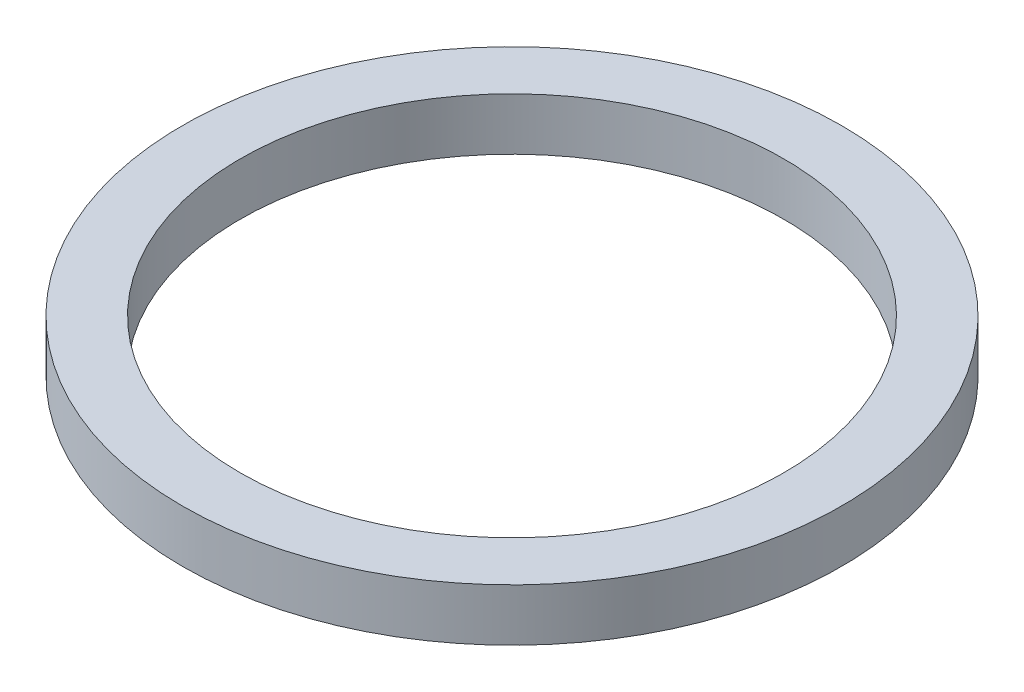
ISO-10303-21;
HEADER;
FILE_DESCRIPTION(('STEP AP214'),'2;1');
FILE_NAME('part.step','',(''),(''),'','','');
FILE_SCHEMA(('AUTOMOTIVE_DESIGN { 1 0 10303 214 1 1 1 1 }'));
ENDSEC;
DATA;
#1=APPLICATION_CONTEXT('core data for automotive mechanical design processes');
#2=APPLICATION_PROTOCOL_DEFINITION('international standard','automotive_design',2000,#1);
#3=PRODUCT_CONTEXT('',#1,'mechanical');
#4=PRODUCT('Part','Part','',(#3));
#5=PRODUCT_RELATED_PRODUCT_CATEGORY('part','',(#4));
#6=PRODUCT_DEFINITION_FORMATION('','',#4);
#7=PRODUCT_DEFINITION_CONTEXT('part definition',#1,'design');
#8=PRODUCT_DEFINITION('design','',#6,#7);
#9=PRODUCT_DEFINITION_SHAPE('','',#8);
#10=(LENGTH_UNIT() NAMED_UNIT(*) SI_UNIT(.MILLI.,.METRE.));
#11=(NAMED_UNIT(*) PLANE_ANGLE_UNIT() SI_UNIT($,.RADIAN.));
#12=(NAMED_UNIT(*) SI_UNIT($,.STERADIAN.) SOLID_ANGLE_UNIT());
#13=UNCERTAINTY_MEASURE_WITH_UNIT(LENGTH_MEASURE(1.E-05),#10,'distance_accuracy_value','');
#14=(GEOMETRIC_REPRESENTATION_CONTEXT(3) GLOBAL_UNCERTAINTY_ASSIGNED_CONTEXT((#13)) GLOBAL_UNIT_ASSIGNED_CONTEXT((#10,
#11,#12)) REPRESENTATION_CONTEXT('',''));
#15=CARTESIAN_POINT('',(0.,0.,0.));
#16=DIRECTION('',(0.,0.,1.));
#17=DIRECTION('',(1.,0.,0.));
#18=AXIS2_PLACEMENT_3D('',#15,#16,#17);
#19=CARTESIAN_POINT('',(0.,11.125,0.));
#20=DIRECTION('',(0.,1.,0.));
#21=DIRECTION('',(0.,0.,1.));
#22=AXIS2_PLACEMENT_3D('',#19,#20,#21);
#23=PLANE('',#22);
#24=CARTESIAN_POINT('',(0.,11.125,0.));
#25=DIRECTION('',(0.,1.,0.));
#26=DIRECTION('',(0.,0.,1.));
#27=AXIS2_PLACEMENT_3D('',#24,#25,#26);
#28=CIRCLE('',#27,20.);
#29=CARTESIAN_POINT('',(0.,11.125,20.));
#30=VERTEX_POINT('',#29);
#31=EDGE_CURVE('E10',#30,#30,#28,.T.);
#32=ORIENTED_EDGE('',*,*,#31,.T.);
#33=EDGE_LOOP('',(#32));
#34=FACE_BOUND('',#33,.T.);
#35=CARTESIAN_POINT('',(0.,11.125,0.));
#36=DIRECTION('',(0.,1.,0.));
#37=DIRECTION('',(0.,0.,1.));
#38=AXIS2_PLACEMENT_3D('',#35,#36,#37);
#39=CIRCLE('',#38,16.5);
#40=CARTESIAN_POINT('',(0.,11.125,16.5));
#41=VERTEX_POINT('',#40);
#42=EDGE_CURVE('E50',#41,#41,#39,.T.);
#43=ORIENTED_EDGE('',*,*,#42,.F.);
#44=EDGE_LOOP('',(#43));
#45=FACE_BOUND('',#44,.T.);
#46=ADVANCED_FACE('F39',(#34,#45),#23,.T.);
#47=CARTESIAN_POINT('',(0.,7.95,0.));
#48=DIRECTION('',(0.,1.,0.));
#49=DIRECTION('',(0.,0.,1.));
#50=AXIS2_PLACEMENT_3D('',#47,#48,#49);
#51=PLANE('',#50);
#52=CARTESIAN_POINT('',(0.,7.95,0.));
#53=DIRECTION('',(0.,1.,0.));
#54=DIRECTION('',(0.,0.,1.));
#55=AXIS2_PLACEMENT_3D('',#52,#53,#54);
#56=CIRCLE('',#55,20.);
#57=CARTESIAN_POINT('',(0.,7.95,20.));
#58=VERTEX_POINT('',#57);
#59=EDGE_CURVE('E43',#58,#58,#56,.T.);
#60=ORIENTED_EDGE('',*,*,#59,.F.);
#61=EDGE_LOOP('',(#60));
#62=FACE_BOUND('',#61,.T.);
#63=CARTESIAN_POINT('',(0.,7.95,0.));
#64=DIRECTION('',(0.,1.,0.));
#65=DIRECTION('',(0.,0.,1.));
#66=AXIS2_PLACEMENT_3D('',#63,#64,#65);
#67=CIRCLE('',#66,16.5);
#68=CARTESIAN_POINT('',(0.,7.95,16.5));
#69=VERTEX_POINT('',#68);
#70=EDGE_CURVE('E52',#69,#69,#67,.T.);
#71=ORIENTED_EDGE('',*,*,#70,.T.);
#72=EDGE_LOOP('',(#71));
#73=FACE_BOUND('',#72,.T.);
#74=ADVANCED_FACE('F62',(#62,#73),#51,.F.);
#75=CARTESIAN_POINT('',(0.,11.125,0.));
#76=DIRECTION('',(0.,-1.,0.));
#77=DIRECTION('',(0.,0.,-1.));
#78=AXIS2_PLACEMENT_3D('',#75,#76,#77);
#79=CYLINDRICAL_SURFACE('',#78,20.);
#80=ORIENTED_EDGE('',*,*,#31,.F.);
#81=EDGE_LOOP('',(#80));
#82=FACE_BOUND('',#81,.T.);
#83=ORIENTED_EDGE('',*,*,#59,.T.);
#84=EDGE_LOOP('',(#83));
#85=FACE_BOUND('',#84,.T.);
#86=ADVANCED_FACE('F41',(#82,#85),#79,.T.);
#87=CARTESIAN_POINT('',(0.,11.125,0.));
#88=DIRECTION('',(0.,-1.,0.));
#89=DIRECTION('',(0.,0.,-1.));
#90=AXIS2_PLACEMENT_3D('',#87,#88,#89);
#91=CYLINDRICAL_SURFACE('',#90,16.5);
#92=ORIENTED_EDGE('',*,*,#42,.T.);
#93=EDGE_LOOP('',(#92));
#94=FACE_BOUND('',#93,.T.);
#95=ORIENTED_EDGE('',*,*,#70,.F.);
#96=EDGE_LOOP('',(#95));
#97=FACE_BOUND('',#96,.T.);
#98=ADVANCED_FACE('F58',(#94,#97),#91,.F.);
#99=CLOSED_SHELL('',(#46,#74,#86,#98));
#100=MANIFOLD_SOLID_BREP('B2',#99);
#101=ADVANCED_BREP_SHAPE_REPRESENTATION('',(#18,#100),#14);
#102=SHAPE_DEFINITION_REPRESENTATION(#9,#101);
ENDSEC;
END-ISO-10303-21;
